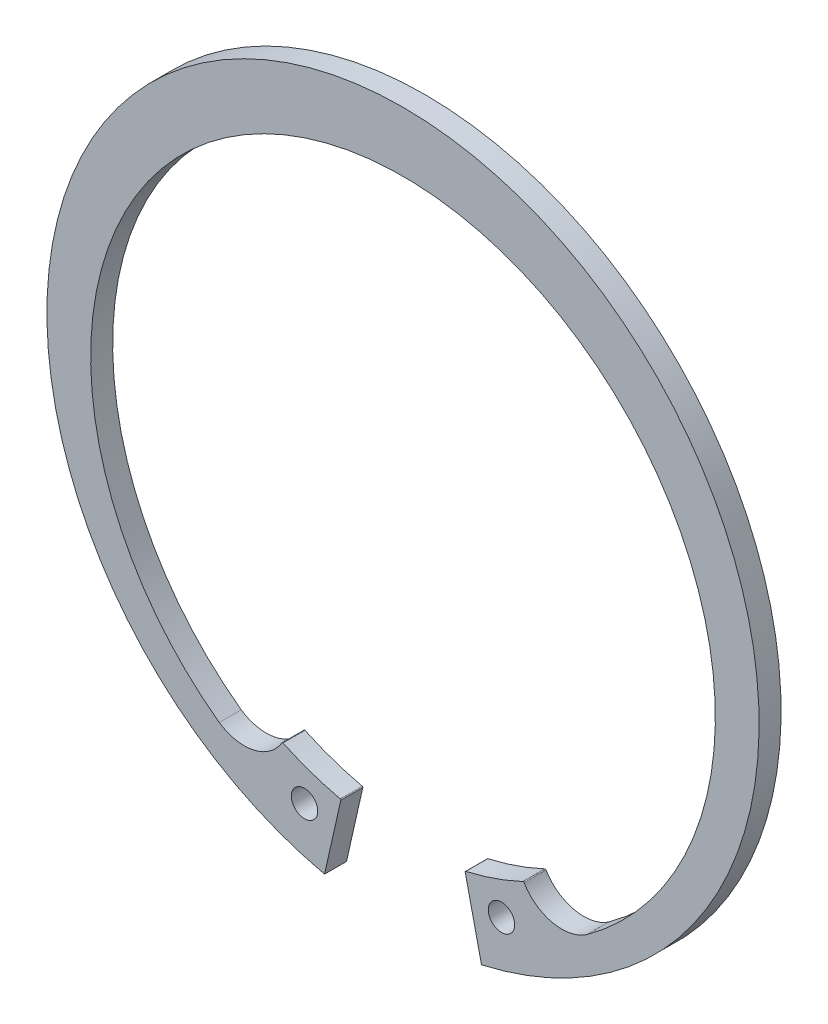
ISO-10303-21;
HEADER;
FILE_DESCRIPTION(('STEP AP214'),'2;1');
FILE_NAME('part.step','',(''),(''),'','','');
FILE_SCHEMA(('AUTOMOTIVE_DESIGN { 1 0 10303 214 1 1 1 1 }'));
ENDSEC;
DATA;
#1=APPLICATION_CONTEXT('core data for automotive mechanical design processes');
#2=APPLICATION_PROTOCOL_DEFINITION('international standard','automotive_design',2000,#1);
#3=PRODUCT_CONTEXT('',#1,'mechanical');
#4=PRODUCT('Part','Part','',(#3));
#5=PRODUCT_RELATED_PRODUCT_CATEGORY('part','',(#4));
#6=PRODUCT_DEFINITION_FORMATION('','',#4);
#7=PRODUCT_DEFINITION_CONTEXT('part definition',#1,'design');
#8=PRODUCT_DEFINITION('design','',#6,#7);
#9=PRODUCT_DEFINITION_SHAPE('','',#8);
#10=(LENGTH_UNIT() NAMED_UNIT(*) SI_UNIT(.MILLI.,.METRE.));
#11=(NAMED_UNIT(*) PLANE_ANGLE_UNIT() SI_UNIT($,.RADIAN.));
#12=(NAMED_UNIT(*) SI_UNIT($,.STERADIAN.) SOLID_ANGLE_UNIT());
#13=UNCERTAINTY_MEASURE_WITH_UNIT(LENGTH_MEASURE(1.E-05),#10,'distance_accuracy_value','');
#14=(GEOMETRIC_REPRESENTATION_CONTEXT(3) GLOBAL_UNCERTAINTY_ASSIGNED_CONTEXT((#13)) GLOBAL_UNIT_ASSIGNED_CONTEXT((#10,
#11,#12)) REPRESENTATION_CONTEXT('',''));
#15=CARTESIAN_POINT('',(0.,0.,0.));
#16=DIRECTION('',(0.,0.,1.));
#17=DIRECTION('',(1.,0.,0.));
#18=AXIS2_PLACEMENT_3D('',#15,#16,#17);
#19=CARTESIAN_POINT('',(0.,0.,-2.5));
#20=DIRECTION('',(0.,0.,1.));
#21=DIRECTION('',(1.,0.,0.));
#22=AXIS2_PLACEMENT_3D('',#19,#20,#21);
#23=CYLINDRICAL_SURFACE('',#22,40.5);
#24=CARTESIAN_POINT('',(0.,0.,-2.5));
#25=DIRECTION('',(0.,0.,1.));
#26=DIRECTION('',(1.,0.,0.));
#27=AXIS2_PLACEMENT_3D('',#24,#25,#26);
#28=CIRCLE('',#27,40.5);
#29=CARTESIAN_POINT('',(8.92675525936561,-39.5039623397374,-2.5));
#30=VERTEX_POINT('',#29);
#31=CARTESIAN_POINT('',(-8.92675525936561,-39.5039623397374,-2.5));
#32=VERTEX_POINT('',#31);
#33=EDGE_CURVE('E147',#30,#32,#28,.T.);
#34=ORIENTED_EDGE('',*,*,#33,.T.);
#35=DIRECTION('',(0.,0.,1.));
#36=VECTOR('',#35,1.);
#37=CARTESIAN_POINT('',(-8.92675525936561,-39.5039623397374,-2.5));
#38=LINE('',#37,#36);
#39=CARTESIAN_POINT('',(-8.92675525936561,-39.5039623397374,0.));
#40=VERTEX_POINT('',#39);
#41=EDGE_CURVE('E37',#32,#40,#38,.T.);
#42=ORIENTED_EDGE('',*,*,#41,.T.);
#43=CARTESIAN_POINT('',(0.,0.,0.));
#44=DIRECTION('',(0.,0.,1.));
#45=DIRECTION('',(1.,0.,0.));
#46=AXIS2_PLACEMENT_3D('',#43,#44,#45);
#47=CIRCLE('',#46,40.5);
#48=CARTESIAN_POINT('',(8.92675525936561,-39.5039623397374,0.));
#49=VERTEX_POINT('',#48);
#50=EDGE_CURVE('E58',#49,#40,#47,.T.);
#51=ORIENTED_EDGE('',*,*,#50,.F.);
#52=DIRECTION('',(0.,0.,1.));
#53=VECTOR('',#52,1.);
#54=CARTESIAN_POINT('',(8.92675525936561,-39.5039623397374,-2.5));
#55=LINE('',#54,#53);
#56=EDGE_CURVE('E11',#30,#49,#55,.T.);
#57=ORIENTED_EDGE('',*,*,#56,.F.);
#58=EDGE_LOOP('',(#34,#42,#51,#57));
#59=FACE_BOUND('',#58,.T.);
#60=ADVANCED_FACE('F34',(#59),#23,.T.);
#61=CARTESIAN_POINT('',(8.92675525936561,-39.5039623397374,-2.5));
#62=DIRECTION('',(-0.975406477524379,-0.220413710107793,0.));
#63=DIRECTION('',(0.220413710107793,-0.975406477524379,0.));
#64=AXIS2_PLACEMENT_3D('',#61,#62,#63);
#65=PLANE('',#64);
#66=DIRECTION('',(0.220413710107793,-0.975406477524379,0.));
#67=VECTOR('',#66,1.);
#68=CARTESIAN_POINT('',(8.92675525936561,-39.5039623397374,0.));
#69=LINE('',#68,#67);
#70=CARTESIAN_POINT('',(7.07524576202325,-31.3103959956908,0.));
#71=VERTEX_POINT('',#70);
#72=EDGE_CURVE('E250',#71,#49,#69,.T.);
#73=ORIENTED_EDGE('',*,*,#72,.F.);
#74=DIRECTION('',(0.,0.,1.));
#75=VECTOR('',#74,1.);
#76=CARTESIAN_POINT('',(7.07524576202325,-31.3103959956908,-2.5));
#77=LINE('',#76,#75);
#78=CARTESIAN_POINT('',(7.07524576202325,-31.3103959956908,-2.5));
#79=VERTEX_POINT('',#78);
#80=EDGE_CURVE('E223',#79,#71,#77,.T.);
#81=ORIENTED_EDGE('',*,*,#80,.F.);
#82=DIRECTION('',(0.220413710107793,-0.975406477524379,0.));
#83=VECTOR('',#82,1.);
#84=CARTESIAN_POINT('',(8.92675525936561,-39.5039623397374,-2.5));
#85=LINE('',#84,#83);
#86=EDGE_CURVE('E253',#79,#30,#85,.T.);
#87=ORIENTED_EDGE('',*,*,#86,.T.);
#88=ORIENTED_EDGE('',*,*,#56,.T.);
#89=EDGE_LOOP('',(#73,#81,#87,#88));
#90=FACE_BOUND('',#89,.T.);
#91=ADVANCED_FACE('F266',(#90),#65,.T.);
#92=CARTESIAN_POINT('',(0.,-1.82466350768134,-2.5));
#93=DIRECTION('',(0.,0.,1.));
#94=DIRECTION('',(1.,0.,0.));
#95=AXIS2_PLACEMENT_3D('',#92,#93,#94);
#96=CYLINDRICAL_SURFACE('',#95,35.5246635076813);
#97=DIRECTION('',(0.,0.,1.));
#98=VECTOR('',#97,1.);
#99=CARTESIAN_POINT('',(-20.8967153707726,-30.5532033948197,-2.5));
#100=LINE('',#99,#98);
#101=CARTESIAN_POINT('',(-20.8967153707726,-30.5532033948197,-2.5));
#102=VERTEX_POINT('',#101);
#103=CARTESIAN_POINT('',(-20.8967153707726,-30.5532033948197,0.));
#104=VERTEX_POINT('',#103);
#105=EDGE_CURVE('E188',#102,#104,#100,.T.);
#106=ORIENTED_EDGE('',*,*,#105,.F.);
#107=CARTESIAN_POINT('',(0.,-1.82466350768134,-2.5));
#108=DIRECTION('',(0.,0.,-1.));
#109=DIRECTION('',(1.,0.,0.));
#110=AXIS2_PLACEMENT_3D('',#107,#108,#109);
#111=CIRCLE('',#110,35.5246635076813);
#112=CARTESIAN_POINT('',(20.8967153707726,-30.5532033948197,-2.5));
#113=VERTEX_POINT('',#112);
#114=EDGE_CURVE('E66',#102,#113,#111,.T.);
#115=ORIENTED_EDGE('',*,*,#114,.T.);
#116=DIRECTION('',(0.,0.,1.));
#117=VECTOR('',#116,1.);
#118=CARTESIAN_POINT('',(20.8967153707726,-30.5532033948197,-2.5));
#119=LINE('',#118,#117);
#120=CARTESIAN_POINT('',(20.8967153707726,-30.5532033948197,0.));
#121=VERTEX_POINT('',#120);
#122=EDGE_CURVE('E226',#121,#113,#119,.F.);
#123=ORIENTED_EDGE('',*,*,#122,.F.);
#124=CARTESIAN_POINT('',(0.,-1.82466350768134,0.));
#125=DIRECTION('',(0.,0.,-1.));
#126=DIRECTION('',(1.,0.,0.));
#127=AXIS2_PLACEMENT_3D('',#124,#125,#126);
#128=CIRCLE('',#127,35.5246635076813);
#129=EDGE_CURVE('E259',#104,#121,#128,.T.);
#130=ORIENTED_EDGE('',*,*,#129,.F.);
#131=EDGE_LOOP('',(#106,#115,#123,#130));
#132=FACE_BOUND('',#131,.T.);
#133=ADVANCED_FACE('F288',(#132),#96,.F.);
#134=CARTESIAN_POINT('',(-8.92675525936561,-39.5039623397374,-2.5));
#135=DIRECTION('',(0.975406477524379,-0.220413710107793,0.));
#136=DIRECTION('',(0.220413710107793,0.975406477524379,0.));
#137=AXIS2_PLACEMENT_3D('',#134,#135,#136);
#138=PLANE('',#137);
#139=DIRECTION('',(0.220413710107793,0.97540647752438,0.));
#140=VECTOR('',#139,1.);
#141=CARTESIAN_POINT('',(-8.92675525936561,-39.5039623397374,0.));
#142=LINE('',#141,#140);
#143=CARTESIAN_POINT('',(-7.07524576202325,-31.3103959956908,0.));
#144=VERTEX_POINT('',#143);
#145=EDGE_CURVE('E257',#40,#144,#142,.T.);
#146=ORIENTED_EDGE('',*,*,#145,.F.);
#147=ORIENTED_EDGE('',*,*,#41,.F.);
#148=DIRECTION('',(0.220413710107793,0.97540647752438,0.));
#149=VECTOR('',#148,1.);
#150=CARTESIAN_POINT('',(-8.92675525936561,-39.5039623397374,-2.5));
#151=LINE('',#150,#149);
#152=CARTESIAN_POINT('',(-7.07524576202325,-31.3103959956908,-2.5));
#153=VERTEX_POINT('',#152);
#154=EDGE_CURVE('E139',#32,#153,#151,.T.);
#155=ORIENTED_EDGE('',*,*,#154,.T.);
#156=DIRECTION('',(0.,0.,1.));
#157=VECTOR('',#156,1.);
#158=CARTESIAN_POINT('',(-7.07524576202325,-31.3103959956908,-2.5));
#159=LINE('',#158,#157);
#160=EDGE_CURVE('E143',#153,#144,#159,.T.);
#161=ORIENTED_EDGE('',*,*,#160,.T.);
#162=EDGE_LOOP('',(#146,#147,#155,#161));
#163=FACE_BOUND('',#162,.T.);
#164=ADVANCED_FACE('F142',(#163),#138,.T.);
#165=CARTESIAN_POINT('',(0.,0.,-2.5));
#166=DIRECTION('',(0.,0.,1.));
#167=DIRECTION('',(1.,0.,0.));
#168=AXIS2_PLACEMENT_3D('',#165,#166,#167);
#169=PLANE('',#168);
#170=ORIENTED_EDGE('',*,*,#114,.F.);
#171=DIRECTION('',(-0.564534710102971,-0.825409329417202,0.));
#172=VECTOR('',#171,1.);
#173=CARTESIAN_POINT('',(-22.8636557591703,-33.4290778413967,-2.5));
#174=LINE('',#173,#172);
#175=CARTESIAN_POINT('',(-20.8953290375962,-30.5511764293967,-2.5));
#176=VERTEX_POINT('',#175);
#177=EDGE_CURVE('E157',#176,#102,#174,.T.);
#178=ORIENTED_EDGE('',*,*,#177,.F.);
#179=CARTESIAN_POINT('',(-18.065110723295,-26.4130985413505,-2.5));
#180=DIRECTION('',(0.,0.,-1.));
#181=DIRECTION('',(1.,0.,0.));
#182=AXIS2_PLACEMENT_3D('',#179,#180,#181);
#183=CIRCLE('',#182,5.01336457024053);
#184=CARTESIAN_POINT('',(-13.7638770753316,-28.9886010980898,-2.5));
#185=VERTEX_POINT('',#184);
#186=EDGE_CURVE('E174',#185,#176,#183,.T.);
#187=ORIENTED_EDGE('',*,*,#186,.F.);
#188=CARTESIAN_POINT('',(-13.6780817259669,-29.0399738343162,-2.5));
#189=DIRECTION('',(0.,0.,1.));
#190=DIRECTION('',(1.,0.,0.));
#191=AXIS2_PLACEMENT_3D('',#188,#189,#190);
#192=CIRCLE('',#191,0.0999999999999995);
#193=CARTESIAN_POINT('',(-13.6354708794686,-28.9495066261096,-2.5));
#194=VERTEX_POINT('',#193);
#195=EDGE_CURVE('E166',#194,#185,#192,.T.);
#196=ORIENTED_EDGE('',*,*,#195,.F.);
#197=CARTESIAN_POINT('',(0.,0.,-2.5));
#198=DIRECTION('',(0.,0.,-1.));
#199=DIRECTION('',(1.,0.,0.));
#200=AXIS2_PLACEMENT_3D('',#197,#198,#199);
#201=CIRCLE('',#200,32.);
#202=CARTESIAN_POINT('',(-7.15044128077327,-31.1908831149458,-2.5));
#203=VERTEX_POINT('',#202);
#204=EDGE_CURVE('E162',#203,#194,#201,.T.);
#205=ORIENTED_EDGE('',*,*,#204,.F.);
#206=CARTESIAN_POINT('',(-7.17278640977569,-31.28835462468,-2.5));
#207=DIRECTION('',(0.,0.,1.));
#208=DIRECTION('',(-1.,0.,0.));
#209=AXIS2_PLACEMENT_3D('',#206,#207,#208);
#210=CIRCLE('',#209,0.100000000000001);
#211=EDGE_CURVE('E153',#153,#203,#210,.T.);
#212=ORIENTED_EDGE('',*,*,#211,.F.);
#213=ORIENTED_EDGE('',*,*,#154,.F.);
#214=ORIENTED_EDGE('',*,*,#33,.F.);
#215=ORIENTED_EDGE('',*,*,#86,.F.);
#216=CARTESIAN_POINT('',(7.17278640977569,-31.28835462468,-2.5));
#217=DIRECTION('',(0.,0.,1.));
#218=DIRECTION('',(1.,0.,0.));
#219=AXIS2_PLACEMENT_3D('',#216,#217,#218);
#220=CIRCLE('',#219,0.1);
#221=CARTESIAN_POINT('',(7.15044128077327,-31.1908831149458,-2.5));
#222=VERTEX_POINT('',#221);
#223=EDGE_CURVE('E208',#222,#79,#220,.T.);
#224=ORIENTED_EDGE('',*,*,#223,.F.);
#225=CARTESIAN_POINT('',(0.,0.,-2.5));
#226=DIRECTION('',(0.,0.,-1.));
#227=DIRECTION('',(1.,0.,0.));
#228=AXIS2_PLACEMENT_3D('',#225,#226,#227);
#229=CIRCLE('',#228,32.);
#230=CARTESIAN_POINT('',(13.6354708794686,-28.9495066261096,-2.5));
#231=VERTEX_POINT('',#230);
#232=EDGE_CURVE('E206',#231,#222,#229,.T.);
#233=ORIENTED_EDGE('',*,*,#232,.F.);
#234=CARTESIAN_POINT('',(13.6780817259669,-29.0399738343162,-2.5));
#235=DIRECTION('',(0.,0.,1.));
#236=DIRECTION('',(-1.,0.,0.));
#237=AXIS2_PLACEMENT_3D('',#234,#235,#236);
#238=CIRCLE('',#237,0.0999999999999995);
#239=CARTESIAN_POINT('',(13.7638770753316,-28.9886010980898,-2.5));
#240=VERTEX_POINT('',#239);
#241=EDGE_CURVE('E203',#240,#231,#238,.T.);
#242=ORIENTED_EDGE('',*,*,#241,.F.);
#243=CARTESIAN_POINT('',(18.065110723295,-26.4130985413505,-2.5));
#244=DIRECTION('',(0.,0.,-1.));
#245=DIRECTION('',(1.,0.,0.));
#246=AXIS2_PLACEMENT_3D('',#243,#244,#245);
#247=CIRCLE('',#246,5.01336457024053);
#248=CARTESIAN_POINT('',(20.8953290375962,-30.5511764293967,-2.5));
#249=VERTEX_POINT('',#248);
#250=EDGE_CURVE('E199',#249,#240,#247,.T.);
#251=ORIENTED_EDGE('',*,*,#250,.F.);
#252=DIRECTION('',(-0.564534710102971,0.825409329417202,0.));
#253=VECTOR('',#252,1.);
#254=CARTESIAN_POINT('',(20.8953290375962,-30.5511764293967,-2.5));
#255=LINE('',#254,#253);
#256=EDGE_CURVE('E197',#113,#249,#255,.T.);
#257=ORIENTED_EDGE('',*,*,#256,.F.);
#258=EDGE_LOOP('',(#170,#178,#187,#196,#205,#212,#213,#214,#215,#224,#233,#242,#251,#257));
#259=FACE_BOUND('',#258,.T.);
#260=CARTESIAN_POINT('',(11.2004873886639,-33.6867790424728,-2.5));
#261=DIRECTION('',(0.,0.,1.));
#262=DIRECTION('',(1.,0.,0.));
#263=AXIS2_PLACEMENT_3D('',#260,#261,#262);
#264=CIRCLE('',#263,1.5);
#265=CARTESIAN_POINT('',(12.7004873886639,-33.6867790424728,-2.5));
#266=VERTEX_POINT('',#265);
#267=EDGE_CURVE('E245',#266,#266,#264,.T.);
#268=ORIENTED_EDGE('',*,*,#267,.T.);
#269=EDGE_LOOP('',(#268));
#270=FACE_BOUND('',#269,.T.);
#271=CARTESIAN_POINT('',(-11.2004873886639,-33.6867790424728,-2.5));
#272=DIRECTION('',(0.,0.,1.));
#273=DIRECTION('',(1.,0.,0.));
#274=AXIS2_PLACEMENT_3D('',#271,#272,#273);
#275=CIRCLE('',#274,1.5);
#276=CARTESIAN_POINT('',(-9.70048738866387,-33.6867790424728,-2.5));
#277=VERTEX_POINT('',#276);
#278=EDGE_CURVE('E239',#277,#277,#275,.T.);
#279=ORIENTED_EDGE('',*,*,#278,.T.);
#280=EDGE_LOOP('',(#279));
#281=FACE_BOUND('',#280,.T.);
#282=ADVANCED_FACE('F159',(#259,#270,#281),#169,.F.);
#283=CARTESIAN_POINT('',(0.,0.,0.));
#284=DIRECTION('',(0.,0.,1.));
#285=DIRECTION('',(1.,0.,0.));
#286=AXIS2_PLACEMENT_3D('',#283,#284,#285);
#287=PLANE('',#286);
#288=DIRECTION('',(-0.564534710102971,-0.825409329417202,0.));
#289=VECTOR('',#288,1.);
#290=CARTESIAN_POINT('',(-22.8636557591703,-33.4290778413967,0.));
#291=LINE('',#290,#289);
#292=CARTESIAN_POINT('',(-20.8953290375962,-30.5511764293967,0.));
#293=VERTEX_POINT('',#292);
#294=EDGE_CURVE('E164',#293,#104,#291,.T.);
#295=ORIENTED_EDGE('',*,*,#294,.T.);
#296=ORIENTED_EDGE('',*,*,#129,.T.);
#297=DIRECTION('',(-0.564534710102971,0.825409329417202,0.));
#298=VECTOR('',#297,1.);
#299=CARTESIAN_POINT('',(20.8953290375962,-30.5511764293967,0.));
#300=LINE('',#299,#298);
#301=CARTESIAN_POINT('',(20.8953290375962,-30.5511764293967,0.));
#302=VERTEX_POINT('',#301);
#303=EDGE_CURVE('E196',#121,#302,#300,.T.);
#304=ORIENTED_EDGE('',*,*,#303,.T.);
#305=CARTESIAN_POINT('',(18.065110723295,-26.4130985413505,0.));
#306=DIRECTION('',(0.,0.,-1.));
#307=DIRECTION('',(1.,0.,0.));
#308=AXIS2_PLACEMENT_3D('',#305,#306,#307);
#309=CIRCLE('',#308,5.01336457024053);
#310=CARTESIAN_POINT('',(13.7638770753316,-28.9886010980898,0.));
#311=VERTEX_POINT('',#310);
#312=EDGE_CURVE('E213',#302,#311,#309,.T.);
#313=ORIENTED_EDGE('',*,*,#312,.T.);
#314=CARTESIAN_POINT('',(13.6780817259669,-29.0399738343162,0.));
#315=DIRECTION('',(0.,0.,1.));
#316=DIRECTION('',(-1.,0.,0.));
#317=AXIS2_PLACEMENT_3D('',#314,#315,#316);
#318=CIRCLE('',#317,0.0999999999999995);
#319=CARTESIAN_POINT('',(13.6354708794686,-28.9495066261096,0.));
#320=VERTEX_POINT('',#319);
#321=EDGE_CURVE('E216',#311,#320,#318,.T.);
#322=ORIENTED_EDGE('',*,*,#321,.T.);
#323=CARTESIAN_POINT('',(0.,0.,0.));
#324=DIRECTION('',(0.,0.,-1.));
#325=DIRECTION('',(1.,0.,0.));
#326=AXIS2_PLACEMENT_3D('',#323,#324,#325);
#327=CIRCLE('',#326,32.);
#328=CARTESIAN_POINT('',(7.15044128077327,-31.1908831149458,0.));
#329=VERTEX_POINT('',#328);
#330=EDGE_CURVE('E219',#320,#329,#327,.T.);
#331=ORIENTED_EDGE('',*,*,#330,.T.);
#332=CARTESIAN_POINT('',(7.17278640977569,-31.28835462468,0.));
#333=DIRECTION('',(0.,0.,1.));
#334=DIRECTION('',(1.,0.,0.));
#335=AXIS2_PLACEMENT_3D('',#332,#333,#334);
#336=CIRCLE('',#335,0.1);
#337=EDGE_CURVE('E200',#329,#71,#336,.T.);
#338=ORIENTED_EDGE('',*,*,#337,.T.);
#339=ORIENTED_EDGE('',*,*,#72,.T.);
#340=ORIENTED_EDGE('',*,*,#50,.T.);
#341=ORIENTED_EDGE('',*,*,#145,.T.);
#342=CARTESIAN_POINT('',(-7.17278640977569,-31.28835462468,0.));
#343=DIRECTION('',(0.,0.,1.));
#344=DIRECTION('',(-1.,0.,0.));
#345=AXIS2_PLACEMENT_3D('',#342,#343,#344);
#346=CIRCLE('',#345,0.100000000000001);
#347=CARTESIAN_POINT('',(-7.15044128077327,-31.1908831149458,0.));
#348=VERTEX_POINT('',#347);
#349=EDGE_CURVE('E155',#144,#348,#346,.T.);
#350=ORIENTED_EDGE('',*,*,#349,.T.);
#351=CARTESIAN_POINT('',(0.,0.,0.));
#352=DIRECTION('',(0.,0.,-1.));
#353=DIRECTION('',(1.,0.,0.));
#354=AXIS2_PLACEMENT_3D('',#351,#352,#353);
#355=CIRCLE('',#354,32.);
#356=CARTESIAN_POINT('',(-13.6354708794686,-28.9495066261096,0.));
#357=VERTEX_POINT('',#356);
#358=EDGE_CURVE('E179',#348,#357,#355,.T.);
#359=ORIENTED_EDGE('',*,*,#358,.T.);
#360=CARTESIAN_POINT('',(-13.6780817259669,-29.0399738343162,0.));
#361=DIRECTION('',(0.,0.,1.));
#362=DIRECTION('',(1.,0.,0.));
#363=AXIS2_PLACEMENT_3D('',#360,#361,#362);
#364=CIRCLE('',#363,0.0999999999999995);
#365=CARTESIAN_POINT('',(-13.7638770753316,-28.9886010980898,0.));
#366=VERTEX_POINT('',#365);
#367=EDGE_CURVE('E181',#357,#366,#364,.T.);
#368=ORIENTED_EDGE('',*,*,#367,.T.);
#369=CARTESIAN_POINT('',(-18.065110723295,-26.4130985413505,0.));
#370=DIRECTION('',(0.,0.,-1.));
#371=DIRECTION('',(1.,0.,0.));
#372=AXIS2_PLACEMENT_3D('',#369,#370,#371);
#373=CIRCLE('',#372,5.01336457024053);
#374=EDGE_CURVE('E169',#366,#293,#373,.T.);
#375=ORIENTED_EDGE('',*,*,#374,.T.);
#376=EDGE_LOOP('',(#295,#296,#304,#313,#322,#331,#338,#339,#340,#341,#350,#359,#368,#375));
#377=FACE_BOUND('',#376,.T.);
#378=CARTESIAN_POINT('',(11.2004873886639,-33.6867790424728,0.));
#379=DIRECTION('',(0.,0.,1.));
#380=DIRECTION('',(1.,0.,0.));
#381=AXIS2_PLACEMENT_3D('',#378,#379,#380);
#382=CIRCLE('',#381,1.5);
#383=CARTESIAN_POINT('',(12.7004873886639,-33.6867790424728,0.));
#384=VERTEX_POINT('',#383);
#385=EDGE_CURVE('E242',#384,#384,#382,.T.);
#386=ORIENTED_EDGE('',*,*,#385,.F.);
#387=EDGE_LOOP('',(#386));
#388=FACE_BOUND('',#387,.T.);
#389=CARTESIAN_POINT('',(-11.2004873886639,-33.6867790424728,0.));
#390=DIRECTION('',(0.,0.,1.));
#391=DIRECTION('',(1.,0.,0.));
#392=AXIS2_PLACEMENT_3D('',#389,#390,#391);
#393=CIRCLE('',#392,1.5);
#394=CARTESIAN_POINT('',(-9.70048738866387,-33.6867790424728,0.));
#395=VERTEX_POINT('',#394);
#396=EDGE_CURVE('E238',#395,#395,#393,.T.);
#397=ORIENTED_EDGE('',*,*,#396,.F.);
#398=EDGE_LOOP('',(#397));
#399=FACE_BOUND('',#398,.T.);
#400=ADVANCED_FACE('F261',(#377,#388,#399),#287,.T.);
#401=CARTESIAN_POINT('',(11.2004873886639,-33.6867790424728,-2.5));
#402=DIRECTION('',(0.,0.,1.));
#403=DIRECTION('',(1.,0.,0.));
#404=AXIS2_PLACEMENT_3D('',#401,#402,#403);
#405=CYLINDRICAL_SURFACE('',#404,1.5);
#406=ORIENTED_EDGE('',*,*,#267,.F.);
#407=EDGE_LOOP('',(#406));
#408=FACE_BOUND('',#407,.T.);
#409=ORIENTED_EDGE('',*,*,#385,.T.);
#410=EDGE_LOOP('',(#409));
#411=FACE_BOUND('',#410,.T.);
#412=ADVANCED_FACE('F311',(#408,#411),#405,.F.);
#413=CARTESIAN_POINT('',(-11.2004873886639,-33.6867790424728,-2.5));
#414=DIRECTION('',(0.,0.,1.));
#415=DIRECTION('',(1.,0.,0.));
#416=AXIS2_PLACEMENT_3D('',#413,#414,#415);
#417=CYLINDRICAL_SURFACE('',#416,1.5);
#418=ORIENTED_EDGE('',*,*,#278,.F.);
#419=EDGE_LOOP('',(#418));
#420=FACE_BOUND('',#419,.T.);
#421=ORIENTED_EDGE('',*,*,#396,.T.);
#422=EDGE_LOOP('',(#421));
#423=FACE_BOUND('',#422,.T.);
#424=ADVANCED_FACE('F304',(#420,#423),#417,.F.);
#425=CARTESIAN_POINT('',(0.,0.,-2.5));
#426=DIRECTION('',(0.,0.,1.));
#427=DIRECTION('',(1.,0.,0.));
#428=AXIS2_PLACEMENT_3D('',#425,#426,#427);
#429=CYLINDRICAL_SURFACE('',#428,32.);
#430=ORIENTED_EDGE('',*,*,#330,.F.);
#431=DIRECTION('',(0.,0.,1.));
#432=VECTOR('',#431,1.);
#433=CARTESIAN_POINT('',(13.6354708794686,-28.9495066261096,-2.5));
#434=LINE('',#433,#432);
#435=EDGE_CURVE('E230',#231,#320,#434,.T.);
#436=ORIENTED_EDGE('',*,*,#435,.F.);
#437=ORIENTED_EDGE('',*,*,#232,.T.);
#438=DIRECTION('',(0.,0.,1.));
#439=VECTOR('',#438,1.);
#440=CARTESIAN_POINT('',(7.15044128077327,-31.1908831149458,-2.5));
#441=LINE('',#440,#439);
#442=EDGE_CURVE('E227',#222,#329,#441,.T.);
#443=ORIENTED_EDGE('',*,*,#442,.T.);
#444=EDGE_LOOP('',(#430,#436,#437,#443));
#445=FACE_BOUND('',#444,.T.);
#446=ADVANCED_FACE('F302',(#445),#429,.F.);
#447=CARTESIAN_POINT('',(7.17278640977569,-31.28835462468,-2.5));
#448=DIRECTION('',(0.,0.,1.));
#449=DIRECTION('',(1.,0.,0.));
#450=AXIS2_PLACEMENT_3D('',#447,#448,#449);
#451=CYLINDRICAL_SURFACE('',#450,0.1);
#452=ORIENTED_EDGE('',*,*,#337,.F.);
#453=ORIENTED_EDGE('',*,*,#442,.F.);
#454=ORIENTED_EDGE('',*,*,#223,.T.);
#455=ORIENTED_EDGE('',*,*,#80,.T.);
#456=EDGE_LOOP('',(#452,#453,#454,#455));
#457=FACE_BOUND('',#456,.T.);
#458=ADVANCED_FACE('F268',(#457),#451,.T.);
#459=CARTESIAN_POINT('',(13.6780817259669,-29.0399738343162,-2.5));
#460=DIRECTION('',(0.,0.,1.));
#461=DIRECTION('',(1.,0.,0.));
#462=AXIS2_PLACEMENT_3D('',#459,#460,#461);
#463=CYLINDRICAL_SURFACE('',#462,0.0999999999999995);
#464=ORIENTED_EDGE('',*,*,#321,.F.);
#465=DIRECTION('',(0.,0.,1.));
#466=VECTOR('',#465,1.);
#467=CARTESIAN_POINT('',(13.7638770753316,-28.9886010980898,-2.5));
#468=LINE('',#467,#466);
#469=EDGE_CURVE('E233',#240,#311,#468,.T.);
#470=ORIENTED_EDGE('',*,*,#469,.F.);
#471=ORIENTED_EDGE('',*,*,#241,.T.);
#472=ORIENTED_EDGE('',*,*,#435,.T.);
#473=EDGE_LOOP('',(#464,#470,#471,#472));
#474=FACE_BOUND('',#473,.T.);
#475=ADVANCED_FACE('F300',(#474),#463,.T.);
#476=CARTESIAN_POINT('',(18.065110723295,-26.4130985413505,-2.5));
#477=DIRECTION('',(0.,0.,1.));
#478=DIRECTION('',(1.,0.,0.));
#479=AXIS2_PLACEMENT_3D('',#476,#477,#478);
#480=CYLINDRICAL_SURFACE('',#479,5.01336457024053);
#481=ORIENTED_EDGE('',*,*,#312,.F.);
#482=DIRECTION('',(0.,0.,1.));
#483=VECTOR('',#482,1.);
#484=CARTESIAN_POINT('',(20.8953290375962,-30.5511764293967,-2.5));
#485=LINE('',#484,#483);
#486=EDGE_CURVE('E211',#249,#302,#485,.T.);
#487=ORIENTED_EDGE('',*,*,#486,.F.);
#488=ORIENTED_EDGE('',*,*,#250,.T.);
#489=ORIENTED_EDGE('',*,*,#469,.T.);
#490=EDGE_LOOP('',(#481,#487,#488,#489));
#491=FACE_BOUND('',#490,.T.);
#492=ADVANCED_FACE('F297',(#491),#480,.F.);
#493=CARTESIAN_POINT('',(20.8953290375962,-30.5511764293967,-2.5));
#494=DIRECTION('',(0.825409329417202,0.564534710102971,0.));
#495=DIRECTION('',(-0.564534710102971,0.825409329417202,0.));
#496=AXIS2_PLACEMENT_3D('',#493,#494,#495);
#497=PLANE('',#496);
#498=ORIENTED_EDGE('',*,*,#303,.F.);
#499=ORIENTED_EDGE('',*,*,#122,.T.);
#500=ORIENTED_EDGE('',*,*,#256,.T.);
#501=ORIENTED_EDGE('',*,*,#486,.T.);
#502=EDGE_LOOP('',(#498,#499,#500,#501));
#503=FACE_BOUND('',#502,.T.);
#504=ADVANCED_FACE('F294',(#503),#497,.T.);
#505=CARTESIAN_POINT('',(0.,0.,-2.5));
#506=DIRECTION('',(0.,0.,1.));
#507=DIRECTION('',(1.,0.,0.));
#508=AXIS2_PLACEMENT_3D('',#505,#506,#507);
#509=CYLINDRICAL_SURFACE('',#508,32.);
#510=ORIENTED_EDGE('',*,*,#358,.F.);
#511=DIRECTION('',(0.,0.,1.));
#512=VECTOR('',#511,1.);
#513=CARTESIAN_POINT('',(-7.15044128077327,-31.1908831149458,-2.5));
#514=LINE('',#513,#512);
#515=EDGE_CURVE('E156',#203,#348,#514,.T.);
#516=ORIENTED_EDGE('',*,*,#515,.F.);
#517=ORIENTED_EDGE('',*,*,#204,.T.);
#518=DIRECTION('',(0.,0.,1.));
#519=VECTOR('',#518,1.);
#520=CARTESIAN_POINT('',(-13.6354708794686,-28.9495066261096,-2.5));
#521=LINE('',#520,#519);
#522=EDGE_CURVE('E191',#194,#357,#521,.T.);
#523=ORIENTED_EDGE('',*,*,#522,.T.);
#524=EDGE_LOOP('',(#510,#516,#517,#523));
#525=FACE_BOUND('',#524,.T.);
#526=ADVANCED_FACE('F276',(#525),#509,.F.);
#527=CARTESIAN_POINT('',(-22.8636557591703,-33.4290778413967,-2.5));
#528=DIRECTION('',(-0.825409329417202,0.564534710102971,0.));
#529=DIRECTION('',(-0.564534710102971,-0.825409329417202,0.));
#530=AXIS2_PLACEMENT_3D('',#527,#528,#529);
#531=PLANE('',#530);
#532=ORIENTED_EDGE('',*,*,#177,.T.);
#533=ORIENTED_EDGE('',*,*,#105,.T.);
#534=ORIENTED_EDGE('',*,*,#294,.F.);
#535=DIRECTION('',(0.,0.,1.));
#536=VECTOR('',#535,1.);
#537=CARTESIAN_POINT('',(-20.8953290375962,-30.5511764293967,-2.5));
#538=LINE('',#537,#536);
#539=EDGE_CURVE('E186',#176,#293,#538,.T.);
#540=ORIENTED_EDGE('',*,*,#539,.F.);
#541=EDGE_LOOP('',(#532,#533,#534,#540));
#542=FACE_BOUND('',#541,.T.);
#543=ADVANCED_FACE('F286',(#542),#531,.T.);
#544=CARTESIAN_POINT('',(-18.065110723295,-26.4130985413505,-2.5));
#545=DIRECTION('',(0.,0.,1.));
#546=DIRECTION('',(1.,0.,0.));
#547=AXIS2_PLACEMENT_3D('',#544,#545,#546);
#548=CYLINDRICAL_SURFACE('',#547,5.01336457024053);
#549=ORIENTED_EDGE('',*,*,#374,.F.);
#550=DIRECTION('',(0.,0.,1.));
#551=VECTOR('',#550,1.);
#552=CARTESIAN_POINT('',(-13.7638770753316,-28.9886010980898,-2.5));
#553=LINE('',#552,#551);
#554=EDGE_CURVE('E189',#185,#366,#553,.T.);
#555=ORIENTED_EDGE('',*,*,#554,.F.);
#556=ORIENTED_EDGE('',*,*,#186,.T.);
#557=ORIENTED_EDGE('',*,*,#539,.T.);
#558=EDGE_LOOP('',(#549,#555,#556,#557));
#559=FACE_BOUND('',#558,.T.);
#560=ADVANCED_FACE('F282',(#559),#548,.F.);
#561=CARTESIAN_POINT('',(-13.6780817259669,-29.0399738343162,-2.5));
#562=DIRECTION('',(0.,0.,1.));
#563=DIRECTION('',(1.,0.,0.));
#564=AXIS2_PLACEMENT_3D('',#561,#562,#563);
#565=CYLINDRICAL_SURFACE('',#564,0.0999999999999995);
#566=ORIENTED_EDGE('',*,*,#367,.F.);
#567=ORIENTED_EDGE('',*,*,#522,.F.);
#568=ORIENTED_EDGE('',*,*,#195,.T.);
#569=ORIENTED_EDGE('',*,*,#554,.T.);
#570=EDGE_LOOP('',(#566,#567,#568,#569));
#571=FACE_BOUND('',#570,.T.);
#572=ADVANCED_FACE('F278',(#571),#565,.T.);
#573=CARTESIAN_POINT('',(-7.17278640977569,-31.28835462468,-2.5));
#574=DIRECTION('',(0.,0.,1.));
#575=DIRECTION('',(1.,0.,0.));
#576=AXIS2_PLACEMENT_3D('',#573,#574,#575);
#577=CYLINDRICAL_SURFACE('',#576,0.100000000000001);
#578=ORIENTED_EDGE('',*,*,#349,.F.);
#579=ORIENTED_EDGE('',*,*,#160,.F.);
#580=ORIENTED_EDGE('',*,*,#211,.T.);
#581=ORIENTED_EDGE('',*,*,#515,.T.);
#582=EDGE_LOOP('',(#578,#579,#580,#581));
#583=FACE_BOUND('',#582,.T.);
#584=ADVANCED_FACE('F151',(#583),#577,.T.);
#585=CLOSED_SHELL('',(#60,#91,#133,#164,#282,#400,#412,#424,#446,#458,#475,#492,#504,#526,#543,
#560,#572,#584));
#586=MANIFOLD_SOLID_BREP('B2',#585);
#587=ADVANCED_BREP_SHAPE_REPRESENTATION('',(#18,#586),#14);
#588=SHAPE_DEFINITION_REPRESENTATION(#9,#587);
ENDSEC;
END-ISO-10303-21;
